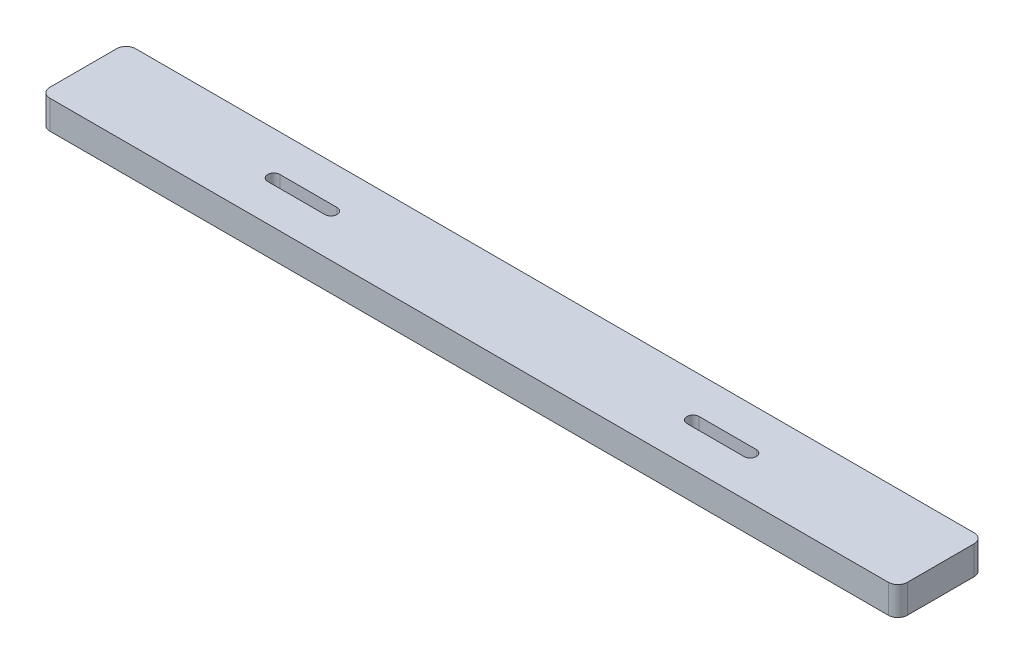
ISO-10303-21;
HEADER;
FILE_DESCRIPTION(('STEP AP214'),'2;1');
FILE_NAME('part.step','',(''),(''),'','','');
FILE_SCHEMA(('AUTOMOTIVE_DESIGN { 1 0 10303 214 1 1 1 1 }'));
ENDSEC;
DATA;
#1=APPLICATION_CONTEXT('core data for automotive mechanical design processes');
#2=APPLICATION_PROTOCOL_DEFINITION('international standard','automotive_design',2000,#1);
#3=PRODUCT_CONTEXT('',#1,'mechanical');
#4=PRODUCT('Part','Part','',(#3));
#5=PRODUCT_RELATED_PRODUCT_CATEGORY('part','',(#4));
#6=PRODUCT_DEFINITION_FORMATION('','',#4);
#7=PRODUCT_DEFINITION_CONTEXT('part definition',#1,'design');
#8=PRODUCT_DEFINITION('design','',#6,#7);
#9=PRODUCT_DEFINITION_SHAPE('','',#8);
#10=(LENGTH_UNIT() NAMED_UNIT(*) SI_UNIT(.MILLI.,.METRE.));
#11=(NAMED_UNIT(*) PLANE_ANGLE_UNIT() SI_UNIT($,.RADIAN.));
#12=(NAMED_UNIT(*) SI_UNIT($,.STERADIAN.) SOLID_ANGLE_UNIT());
#13=UNCERTAINTY_MEASURE_WITH_UNIT(LENGTH_MEASURE(1.E-05),#10,'distance_accuracy_value','');
#14=(GEOMETRIC_REPRESENTATION_CONTEXT(3) GLOBAL_UNCERTAINTY_ASSIGNED_CONTEXT((#13)) GLOBAL_UNIT_ASSIGNED_CONTEXT((#10,
#11,#12)) REPRESENTATION_CONTEXT('',''));
#15=CARTESIAN_POINT('',(0.,0.,0.));
#16=DIRECTION('',(0.,0.,1.));
#17=DIRECTION('',(1.,0.,0.));
#18=AXIS2_PLACEMENT_3D('',#15,#16,#17);
#19=CARTESIAN_POINT('',(-285.75,19.05,28.575));
#20=DIRECTION('',(1.,0.,0.));
#21=DIRECTION('',(0.,0.,-1.));
#22=AXIS2_PLACEMENT_3D('',#19,#20,#21);
#23=PLANE('',#22);
#24=DIRECTION('',(0.,0.,1.));
#25=VECTOR('',#24,1.);
#26=CARTESIAN_POINT('',(-285.75,19.05,28.575));
#27=LINE('',#26,#25);
#28=CARTESIAN_POINT('',(-285.75,19.05,-22.225));
#29=VERTEX_POINT('',#28);
#30=CARTESIAN_POINT('',(-285.75,19.05,22.225));
#31=VERTEX_POINT('',#30);
#32=EDGE_CURVE('E218',#29,#31,#27,.T.);
#33=ORIENTED_EDGE('',*,*,#32,.F.);
#34=DIRECTION('',(0.,-1.,0.));
#35=VECTOR('',#34,1.);
#36=CARTESIAN_POINT('',(-285.75,19.05,-22.225));
#37=LINE('',#36,#35);
#38=CARTESIAN_POINT('',(-285.75,0.,-22.225));
#39=VERTEX_POINT('',#38);
#40=EDGE_CURVE('E246',#29,#39,#37,.T.);
#41=ORIENTED_EDGE('',*,*,#40,.T.);
#42=DIRECTION('',(0.,0.,1.));
#43=VECTOR('',#42,1.);
#44=CARTESIAN_POINT('',(-285.75,0.,28.575));
#45=LINE('',#44,#43);
#46=CARTESIAN_POINT('',(-285.75,0.,22.225));
#47=VERTEX_POINT('',#46);
#48=EDGE_CURVE('E211',#39,#47,#45,.T.);
#49=ORIENTED_EDGE('',*,*,#48,.T.);
#50=DIRECTION('',(0.,-1.,0.));
#51=VECTOR('',#50,1.);
#52=CARTESIAN_POINT('',(-285.75,19.05,22.225));
#53=LINE('',#52,#51);
#54=EDGE_CURVE('E231',#47,#31,#53,.F.);
#55=ORIENTED_EDGE('',*,*,#54,.T.);
#56=EDGE_LOOP('',(#33,#41,#49,#55));
#57=FACE_BOUND('',#56,.T.);
#58=ADVANCED_FACE('F35',(#57),#23,.F.);
#59=CARTESIAN_POINT('',(285.75,19.05,28.575));
#60=DIRECTION('',(0.,0.,-1.));
#61=DIRECTION('',(-1.,0.,0.));
#62=AXIS2_PLACEMENT_3D('',#59,#60,#61);
#63=PLANE('',#62);
#64=DIRECTION('',(1.,0.,0.));
#65=VECTOR('',#64,1.);
#66=CARTESIAN_POINT('',(285.75,0.,28.575));
#67=LINE('',#66,#65);
#68=CARTESIAN_POINT('',(-279.4,0.,28.575));
#69=VERTEX_POINT('',#68);
#70=CARTESIAN_POINT('',(279.4,0.,28.575));
#71=VERTEX_POINT('',#70);
#72=EDGE_CURVE('E234',#69,#71,#67,.T.);
#73=ORIENTED_EDGE('',*,*,#72,.T.);
#74=DIRECTION('',(0.,-1.,0.));
#75=VECTOR('',#74,1.);
#76=CARTESIAN_POINT('',(279.4,19.05,28.575));
#77=LINE('',#76,#75);
#78=CARTESIAN_POINT('',(279.4,19.05,28.575));
#79=VERTEX_POINT('',#78);
#80=EDGE_CURVE('E11',#71,#79,#77,.F.);
#81=ORIENTED_EDGE('',*,*,#80,.T.);
#82=DIRECTION('',(1.,0.,0.));
#83=VECTOR('',#82,1.);
#84=CARTESIAN_POINT('',(285.75,19.05,28.575));
#85=LINE('',#84,#83);
#86=CARTESIAN_POINT('',(-279.4,19.05,28.575));
#87=VERTEX_POINT('',#86);
#88=EDGE_CURVE('E221',#87,#79,#85,.T.);
#89=ORIENTED_EDGE('',*,*,#88,.F.);
#90=DIRECTION('',(0.,-1.,0.));
#91=VECTOR('',#90,1.);
#92=CARTESIAN_POINT('',(-279.4,19.05,28.575));
#93=LINE('',#92,#91);
#94=EDGE_CURVE('E44',#87,#69,#93,.T.);
#95=ORIENTED_EDGE('',*,*,#94,.T.);
#96=EDGE_LOOP('',(#73,#81,#89,#95));
#97=FACE_BOUND('',#96,.T.);
#98=ADVANCED_FACE('F280',(#97),#63,.F.);
#99=CARTESIAN_POINT('',(285.75,19.05,28.575));
#100=DIRECTION('',(-1.,0.,0.));
#101=DIRECTION('',(0.,0.,1.));
#102=AXIS2_PLACEMENT_3D('',#99,#100,#101);
#103=PLANE('',#102);
#104=DIRECTION('',(0.,0.,-1.));
#105=VECTOR('',#104,1.);
#106=CARTESIAN_POINT('',(285.75,0.,28.575));
#107=LINE('',#106,#105);
#108=CARTESIAN_POINT('',(285.75,0.,22.225));
#109=VERTEX_POINT('',#108);
#110=CARTESIAN_POINT('',(285.75,0.,-22.225));
#111=VERTEX_POINT('',#110);
#112=EDGE_CURVE('E237',#109,#111,#107,.T.);
#113=ORIENTED_EDGE('',*,*,#112,.T.);
#114=DIRECTION('',(0.,-1.,0.));
#115=VECTOR('',#114,1.);
#116=CARTESIAN_POINT('',(285.75,19.05,-22.225));
#117=LINE('',#116,#115);
#118=CARTESIAN_POINT('',(285.75,19.05,-22.225));
#119=VERTEX_POINT('',#118);
#120=EDGE_CURVE('E274',#111,#119,#117,.F.);
#121=ORIENTED_EDGE('',*,*,#120,.T.);
#122=DIRECTION('',(0.,0.,-1.));
#123=VECTOR('',#122,1.);
#124=CARTESIAN_POINT('',(285.75,19.05,28.575));
#125=LINE('',#124,#123);
#126=CARTESIAN_POINT('',(285.75,19.05,22.225));
#127=VERTEX_POINT('',#126);
#128=EDGE_CURVE('E225',#127,#119,#125,.T.);
#129=ORIENTED_EDGE('',*,*,#128,.F.);
#130=DIRECTION('',(0.,-1.,0.));
#131=VECTOR('',#130,1.);
#132=CARTESIAN_POINT('',(285.75,19.05,22.225));
#133=LINE('',#132,#131);
#134=EDGE_CURVE('E271',#127,#109,#133,.T.);
#135=ORIENTED_EDGE('',*,*,#134,.T.);
#136=EDGE_LOOP('',(#113,#121,#129,#135));
#137=FACE_BOUND('',#136,.T.);
#138=ADVANCED_FACE('F293',(#137),#103,.F.);
#139=CARTESIAN_POINT('',(285.75,19.05,-28.575));
#140=DIRECTION('',(0.,0.,1.));
#141=DIRECTION('',(1.,0.,0.));
#142=AXIS2_PLACEMENT_3D('',#139,#140,#141);
#143=PLANE('',#142);
#144=DIRECTION('',(-1.,0.,0.));
#145=VECTOR('',#144,1.);
#146=CARTESIAN_POINT('',(285.75,0.,-28.575));
#147=LINE('',#146,#145);
#148=CARTESIAN_POINT('',(279.4,0.,-28.575));
#149=VERTEX_POINT('',#148);
#150=CARTESIAN_POINT('',(-279.4,0.,-28.575));
#151=VERTEX_POINT('',#150);
#152=EDGE_CURVE('E222',#149,#151,#147,.T.);
#153=ORIENTED_EDGE('',*,*,#152,.T.);
#154=DIRECTION('',(0.,-1.,0.));
#155=VECTOR('',#154,1.);
#156=CARTESIAN_POINT('',(-279.4,19.05,-28.575));
#157=LINE('',#156,#155);
#158=CARTESIAN_POINT('',(-279.4,19.05,-28.575));
#159=VERTEX_POINT('',#158);
#160=EDGE_CURVE('E260',#151,#159,#157,.F.);
#161=ORIENTED_EDGE('',*,*,#160,.T.);
#162=DIRECTION('',(-1.,0.,0.));
#163=VECTOR('',#162,1.);
#164=CARTESIAN_POINT('',(285.75,19.05,-28.575));
#165=LINE('',#164,#163);
#166=CARTESIAN_POINT('',(279.4,19.05,-28.575));
#167=VERTEX_POINT('',#166);
#168=EDGE_CURVE('E228',#167,#159,#165,.T.);
#169=ORIENTED_EDGE('',*,*,#168,.F.);
#170=DIRECTION('',(0.,-1.,0.));
#171=VECTOR('',#170,1.);
#172=CARTESIAN_POINT('',(279.4,19.05,-28.575));
#173=LINE('',#172,#171);
#174=EDGE_CURVE('E257',#167,#149,#173,.T.);
#175=ORIENTED_EDGE('',*,*,#174,.T.);
#176=EDGE_LOOP('',(#153,#161,#169,#175));
#177=FACE_BOUND('',#176,.T.);
#178=ADVANCED_FACE('F304',(#177),#143,.F.);
#179=CARTESIAN_POINT('',(0.,19.05,0.));
#180=DIRECTION('',(0.,1.,0.));
#181=DIRECTION('',(0.,0.,1.));
#182=AXIS2_PLACEMENT_3D('',#179,#180,#181);
#183=PLANE('',#182);
#184=CARTESIAN_POINT('',(120.65,19.05,0.));
#185=DIRECTION('',(0.,1.,0.));
#186=DIRECTION('',(0.,0.,-1.));
#187=AXIS2_PLACEMENT_3D('',#184,#185,#186);
#188=CIRCLE('',#187,4.06400000000001);
#189=CARTESIAN_POINT('',(120.65,19.05,-4.06400000000004));
#190=VERTEX_POINT('',#189);
#191=CARTESIAN_POINT('',(120.65,19.05,4.06399999999998));
#192=VERTEX_POINT('',#191);
#193=EDGE_CURVE('E51',#190,#192,#188,.T.);
#194=ORIENTED_EDGE('',*,*,#193,.F.);
#195=DIRECTION('',(-1.,0.,0.));
#196=VECTOR('',#195,1.);
#197=CARTESIAN_POINT('',(120.65,19.05,-4.06400000000004));
#198=LINE('',#197,#196);
#199=CARTESIAN_POINT('',(158.75,19.05,-4.06400000000001));
#200=VERTEX_POINT('',#199);
#201=EDGE_CURVE('E166',#200,#190,#198,.T.);
#202=ORIENTED_EDGE('',*,*,#201,.F.);
#203=CARTESIAN_POINT('',(158.75,19.05,0.));
#204=DIRECTION('',(0.,1.,0.));
#205=DIRECTION('',(0.,0.,-1.));
#206=AXIS2_PLACEMENT_3D('',#203,#204,#205);
#207=CIRCLE('',#206,4.06400000000002);
#208=CARTESIAN_POINT('',(158.75,19.05,4.06399999999998));
#209=VERTEX_POINT('',#208);
#210=EDGE_CURVE('E169',#209,#200,#207,.T.);
#211=ORIENTED_EDGE('',*,*,#210,.F.);
#212=DIRECTION('',(1.,0.,0.));
#213=VECTOR('',#212,1.);
#214=CARTESIAN_POINT('',(120.65,19.05,4.06399999999998));
#215=LINE('',#214,#213);
#216=EDGE_CURVE('E176',#192,#209,#215,.T.);
#217=ORIENTED_EDGE('',*,*,#216,.F.);
#218=EDGE_LOOP('',(#194,#202,#211,#217));
#219=FACE_BOUND('',#218,.T.);
#220=CARTESIAN_POINT('',(-120.65,19.05,0.));
#221=DIRECTION('',(0.,1.,0.));
#222=DIRECTION('',(0.,0.,1.));
#223=AXIS2_PLACEMENT_3D('',#220,#221,#222);
#224=CIRCLE('',#223,4.06400000000001);
#225=CARTESIAN_POINT('',(-120.65,19.05,4.06399999999998));
#226=VERTEX_POINT('',#225);
#227=CARTESIAN_POINT('',(-120.65,19.05,-4.06400000000004));
#228=VERTEX_POINT('',#227);
#229=EDGE_CURVE('E182',#226,#228,#224,.T.);
#230=ORIENTED_EDGE('',*,*,#229,.F.);
#231=DIRECTION('',(1.,0.,0.));
#232=VECTOR('',#231,1.);
#233=CARTESIAN_POINT('',(-120.65,19.05,4.06399999999998));
#234=LINE('',#233,#232);
#235=CARTESIAN_POINT('',(-158.75,19.05,4.06399999999998));
#236=VERTEX_POINT('',#235);
#237=EDGE_CURVE('E190',#236,#226,#234,.T.);
#238=ORIENTED_EDGE('',*,*,#237,.F.);
#239=CARTESIAN_POINT('',(-158.75,19.05,0.));
#240=DIRECTION('',(0.,1.,0.));
#241=DIRECTION('',(0.,0.,1.));
#242=AXIS2_PLACEMENT_3D('',#239,#240,#241);
#243=CIRCLE('',#242,4.06400000000002);
#244=CARTESIAN_POINT('',(-158.75,19.05,-4.06400000000001));
#245=VERTEX_POINT('',#244);
#246=EDGE_CURVE('E204',#245,#236,#243,.T.);
#247=ORIENTED_EDGE('',*,*,#246,.F.);
#248=DIRECTION('',(-1.,0.,0.));
#249=VECTOR('',#248,1.);
#250=CARTESIAN_POINT('',(-120.65,19.05,-4.06400000000004));
#251=LINE('',#250,#249);
#252=EDGE_CURVE('E201',#228,#245,#251,.T.);
#253=ORIENTED_EDGE('',*,*,#252,.F.);
#254=EDGE_LOOP('',(#230,#238,#247,#253));
#255=FACE_BOUND('',#254,.T.);
#256=ORIENTED_EDGE('',*,*,#168,.T.);
#257=CARTESIAN_POINT('',(-279.4,19.05,-22.225));
#258=DIRECTION('',(0.,1.,0.));
#259=DIRECTION('',(0.,0.,1.));
#260=AXIS2_PLACEMENT_3D('',#257,#258,#259);
#261=CIRCLE('',#260,6.35);
#262=EDGE_CURVE('E269',#159,#29,#261,.T.);
#263=ORIENTED_EDGE('',*,*,#262,.T.);
#264=ORIENTED_EDGE('',*,*,#32,.T.);
#265=CARTESIAN_POINT('',(-279.4,19.05,22.225));
#266=DIRECTION('',(0.,1.,0.));
#267=DIRECTION('',(0.,0.,1.));
#268=AXIS2_PLACEMENT_3D('',#265,#266,#267);
#269=CIRCLE('',#268,6.35);
#270=EDGE_CURVE('E263',#31,#87,#269,.T.);
#271=ORIENTED_EDGE('',*,*,#270,.T.);
#272=ORIENTED_EDGE('',*,*,#88,.T.);
#273=CARTESIAN_POINT('',(279.4,19.05,22.225));
#274=DIRECTION('',(0.,1.,0.));
#275=DIRECTION('',(0.,0.,1.));
#276=AXIS2_PLACEMENT_3D('',#273,#274,#275);
#277=CIRCLE('',#276,6.35);
#278=EDGE_CURVE('E265',#79,#127,#277,.T.);
#279=ORIENTED_EDGE('',*,*,#278,.T.);
#280=ORIENTED_EDGE('',*,*,#128,.T.);
#281=CARTESIAN_POINT('',(279.4,19.05,-22.225));
#282=DIRECTION('',(0.,1.,0.));
#283=DIRECTION('',(0.,0.,1.));
#284=AXIS2_PLACEMENT_3D('',#281,#282,#283);
#285=CIRCLE('',#284,6.35);
#286=EDGE_CURVE('E267',#119,#167,#285,.T.);
#287=ORIENTED_EDGE('',*,*,#286,.T.);
#288=EDGE_LOOP('',(#256,#263,#264,#271,#272,#279,#280,#287));
#289=FACE_BOUND('',#288,.T.);
#290=ADVANCED_FACE('F297',(#219,#255,#289),#183,.T.);
#291=CARTESIAN_POINT('',(0.,0.,0.));
#292=DIRECTION('',(0.,1.,0.));
#293=DIRECTION('',(0.,0.,1.));
#294=AXIS2_PLACEMENT_3D('',#291,#292,#293);
#295=PLANE('',#294);
#296=DIRECTION('',(-1.,0.,0.));
#297=VECTOR('',#296,1.);
#298=CARTESIAN_POINT('',(120.65,0.,-4.06400000000004));
#299=LINE('',#298,#297);
#300=CARTESIAN_POINT('',(158.75,0.,-4.06400000000001));
#301=VERTEX_POINT('',#300);
#302=CARTESIAN_POINT('',(120.65,0.,-4.06400000000004));
#303=VERTEX_POINT('',#302);
#304=EDGE_CURVE('E156',#301,#303,#299,.T.);
#305=ORIENTED_EDGE('',*,*,#304,.T.);
#306=CARTESIAN_POINT('',(120.65,0.,0.));
#307=DIRECTION('',(0.,1.,0.));
#308=DIRECTION('',(0.,0.,-1.));
#309=AXIS2_PLACEMENT_3D('',#306,#307,#308);
#310=CIRCLE('',#309,4.06400000000001);
#311=CARTESIAN_POINT('',(120.65,0.,4.06399999999998));
#312=VERTEX_POINT('',#311);
#313=EDGE_CURVE('E150',#303,#312,#310,.T.);
#314=ORIENTED_EDGE('',*,*,#313,.T.);
#315=DIRECTION('',(1.,0.,0.));
#316=VECTOR('',#315,1.);
#317=CARTESIAN_POINT('',(120.65,0.,4.06399999999998));
#318=LINE('',#317,#316);
#319=CARTESIAN_POINT('',(158.75,0.,4.06399999999998));
#320=VERTEX_POINT('',#319);
#321=EDGE_CURVE('E159',#312,#320,#318,.T.);
#322=ORIENTED_EDGE('',*,*,#321,.T.);
#323=CARTESIAN_POINT('',(158.75,0.,0.));
#324=DIRECTION('',(0.,1.,0.));
#325=DIRECTION('',(0.,0.,-1.));
#326=AXIS2_PLACEMENT_3D('',#323,#324,#325);
#327=CIRCLE('',#326,4.06400000000002);
#328=EDGE_CURVE('E59',#320,#301,#327,.T.);
#329=ORIENTED_EDGE('',*,*,#328,.T.);
#330=EDGE_LOOP('',(#305,#314,#322,#329));
#331=FACE_BOUND('',#330,.T.);
#332=DIRECTION('',(1.,0.,0.));
#333=VECTOR('',#332,1.);
#334=CARTESIAN_POINT('',(-120.65,0.,4.06399999999998));
#335=LINE('',#334,#333);
#336=CARTESIAN_POINT('',(-158.75,0.,4.06399999999998));
#337=VERTEX_POINT('',#336);
#338=CARTESIAN_POINT('',(-120.65,0.,4.06399999999998));
#339=VERTEX_POINT('',#338);
#340=EDGE_CURVE('E196',#337,#339,#335,.T.);
#341=ORIENTED_EDGE('',*,*,#340,.T.);
#342=CARTESIAN_POINT('',(-120.65,0.,0.));
#343=DIRECTION('',(0.,1.,0.));
#344=DIRECTION('',(0.,0.,1.));
#345=AXIS2_PLACEMENT_3D('',#342,#343,#344);
#346=CIRCLE('',#345,4.06400000000001);
#347=CARTESIAN_POINT('',(-120.65,0.,-4.06400000000004));
#348=VERTEX_POINT('',#347);
#349=EDGE_CURVE('E186',#339,#348,#346,.T.);
#350=ORIENTED_EDGE('',*,*,#349,.T.);
#351=DIRECTION('',(-1.,0.,0.));
#352=VECTOR('',#351,1.);
#353=CARTESIAN_POINT('',(-120.65,0.,-4.06400000000004));
#354=LINE('',#353,#352);
#355=CARTESIAN_POINT('',(-158.75,0.,-4.06400000000006));
#356=VERTEX_POINT('',#355);
#357=EDGE_CURVE('E189',#348,#356,#354,.T.);
#358=ORIENTED_EDGE('',*,*,#357,.T.);
#359=CARTESIAN_POINT('',(-158.75,0.,0.));
#360=DIRECTION('',(0.,1.,0.));
#361=DIRECTION('',(0.,0.,1.));
#362=AXIS2_PLACEMENT_3D('',#359,#360,#361);
#363=CIRCLE('',#362,4.06400000000002);
#364=EDGE_CURVE('E193',#356,#337,#363,.T.);
#365=ORIENTED_EDGE('',*,*,#364,.T.);
#366=EDGE_LOOP('',(#341,#350,#358,#365));
#367=FACE_BOUND('',#366,.T.);
#368=ORIENTED_EDGE('',*,*,#48,.F.);
#369=CARTESIAN_POINT('',(-279.4,0.,-22.225));
#370=DIRECTION('',(0.,1.,0.));
#371=DIRECTION('',(0.,0.,1.));
#372=AXIS2_PLACEMENT_3D('',#369,#370,#371);
#373=CIRCLE('',#372,6.35);
#374=EDGE_CURVE('E255',#39,#151,#373,.F.);
#375=ORIENTED_EDGE('',*,*,#374,.T.);
#376=ORIENTED_EDGE('',*,*,#152,.F.);
#377=CARTESIAN_POINT('',(279.4,0.,-22.225));
#378=DIRECTION('',(0.,1.,0.));
#379=DIRECTION('',(0.,0.,1.));
#380=AXIS2_PLACEMENT_3D('',#377,#378,#379);
#381=CIRCLE('',#380,6.35);
#382=EDGE_CURVE('E253',#149,#111,#381,.F.);
#383=ORIENTED_EDGE('',*,*,#382,.T.);
#384=ORIENTED_EDGE('',*,*,#112,.F.);
#385=CARTESIAN_POINT('',(279.4,0.,22.225));
#386=DIRECTION('',(0.,1.,0.));
#387=DIRECTION('',(0.,0.,1.));
#388=AXIS2_PLACEMENT_3D('',#385,#386,#387);
#389=CIRCLE('',#388,6.35);
#390=EDGE_CURVE('E251',#109,#71,#389,.F.);
#391=ORIENTED_EDGE('',*,*,#390,.T.);
#392=ORIENTED_EDGE('',*,*,#72,.F.);
#393=CARTESIAN_POINT('',(-279.4,0.,22.225));
#394=DIRECTION('',(0.,1.,0.));
#395=DIRECTION('',(0.,0.,1.));
#396=AXIS2_PLACEMENT_3D('',#393,#394,#395);
#397=CIRCLE('',#396,6.35);
#398=EDGE_CURVE('E249',#69,#47,#397,.F.);
#399=ORIENTED_EDGE('',*,*,#398,.T.);
#400=EDGE_LOOP('',(#368,#375,#376,#383,#384,#391,#392,#399));
#401=FACE_BOUND('',#400,.T.);
#402=ADVANCED_FACE('F163',(#331,#367,#401),#295,.F.);
#403=CARTESIAN_POINT('',(-279.4,19.05,-22.225));
#404=DIRECTION('',(0.,-1.,0.));
#405=DIRECTION('',(0.,0.,-1.));
#406=AXIS2_PLACEMENT_3D('',#403,#404,#405);
#407=CYLINDRICAL_SURFACE('',#406,6.35);
#408=ORIENTED_EDGE('',*,*,#262,.F.);
#409=ORIENTED_EDGE('',*,*,#160,.F.);
#410=ORIENTED_EDGE('',*,*,#374,.F.);
#411=ORIENTED_EDGE('',*,*,#40,.F.);
#412=EDGE_LOOP('',(#408,#409,#410,#411));
#413=FACE_BOUND('',#412,.T.);
#414=ADVANCED_FACE('F309',(#413),#407,.T.);
#415=CARTESIAN_POINT('',(279.4,19.05,-22.225));
#416=DIRECTION('',(0.,-1.,0.));
#417=DIRECTION('',(0.,0.,-1.));
#418=AXIS2_PLACEMENT_3D('',#415,#416,#417);
#419=CYLINDRICAL_SURFACE('',#418,6.35);
#420=ORIENTED_EDGE('',*,*,#286,.F.);
#421=ORIENTED_EDGE('',*,*,#120,.F.);
#422=ORIENTED_EDGE('',*,*,#382,.F.);
#423=ORIENTED_EDGE('',*,*,#174,.F.);
#424=EDGE_LOOP('',(#420,#421,#422,#423));
#425=FACE_BOUND('',#424,.T.);
#426=ADVANCED_FACE('F301',(#425),#419,.T.);
#427=CARTESIAN_POINT('',(279.4,19.05,22.225));
#428=DIRECTION('',(0.,-1.,0.));
#429=DIRECTION('',(0.,0.,-1.));
#430=AXIS2_PLACEMENT_3D('',#427,#428,#429);
#431=CYLINDRICAL_SURFACE('',#430,6.35);
#432=ORIENTED_EDGE('',*,*,#278,.F.);
#433=ORIENTED_EDGE('',*,*,#80,.F.);
#434=ORIENTED_EDGE('',*,*,#390,.F.);
#435=ORIENTED_EDGE('',*,*,#134,.F.);
#436=EDGE_LOOP('',(#432,#433,#434,#435));
#437=FACE_BOUND('',#436,.T.);
#438=ADVANCED_FACE('F290',(#437),#431,.T.);
#439=CARTESIAN_POINT('',(-279.4,19.05,22.225));
#440=DIRECTION('',(0.,-1.,0.));
#441=DIRECTION('',(0.,0.,-1.));
#442=AXIS2_PLACEMENT_3D('',#439,#440,#441);
#443=CYLINDRICAL_SURFACE('',#442,6.35);
#444=ORIENTED_EDGE('',*,*,#270,.F.);
#445=ORIENTED_EDGE('',*,*,#54,.F.);
#446=ORIENTED_EDGE('',*,*,#398,.F.);
#447=ORIENTED_EDGE('',*,*,#94,.F.);
#448=EDGE_LOOP('',(#444,#445,#446,#447));
#449=FACE_BOUND('',#448,.T.);
#450=ADVANCED_FACE('F37',(#449),#443,.T.);
#451=CARTESIAN_POINT('',(-120.65,0.,0.));
#452=DIRECTION('',(0.,1.,0.));
#453=DIRECTION('',(0.,0.,1.));
#454=AXIS2_PLACEMENT_3D('',#451,#452,#453);
#455=CYLINDRICAL_SURFACE('',#454,4.06400000000001);
#456=ORIENTED_EDGE('',*,*,#229,.T.);
#457=DIRECTION('',(0.,1.,0.));
#458=VECTOR('',#457,1.);
#459=CARTESIAN_POINT('',(-120.65,0.,-4.06400000000004));
#460=LINE('',#459,#458);
#461=EDGE_CURVE('E199',#348,#228,#460,.T.);
#462=ORIENTED_EDGE('',*,*,#461,.F.);
#463=ORIENTED_EDGE('',*,*,#349,.F.);
#464=DIRECTION('',(0.,1.,0.));
#465=VECTOR('',#464,1.);
#466=CARTESIAN_POINT('',(-120.65,0.,4.06399999999998));
#467=LINE('',#466,#465);
#468=EDGE_CURVE('E209',#339,#226,#467,.T.);
#469=ORIENTED_EDGE('',*,*,#468,.T.);
#470=EDGE_LOOP('',(#456,#462,#463,#469));
#471=FACE_BOUND('',#470,.T.);
#472=ADVANCED_FACE('F314',(#471),#455,.F.);
#473=CARTESIAN_POINT('',(-120.65,0.,4.06399999999998));
#474=DIRECTION('',(0.,0.,1.));
#475=DIRECTION('',(1.,0.,0.));
#476=AXIS2_PLACEMENT_3D('',#473,#474,#475);
#477=PLANE('',#476);
#478=ORIENTED_EDGE('',*,*,#237,.T.);
#479=ORIENTED_EDGE('',*,*,#468,.F.);
#480=ORIENTED_EDGE('',*,*,#340,.F.);
#481=DIRECTION('',(0.,1.,0.));
#482=VECTOR('',#481,1.);
#483=CARTESIAN_POINT('',(-158.75,0.,4.06399999999998));
#484=LINE('',#483,#482);
#485=EDGE_CURVE('E212',#337,#236,#484,.T.);
#486=ORIENTED_EDGE('',*,*,#485,.T.);
#487=EDGE_LOOP('',(#478,#479,#480,#486));
#488=FACE_BOUND('',#487,.T.);
#489=ADVANCED_FACE('F319',(#488),#477,.F.);
#490=CARTESIAN_POINT('',(-158.75,0.,0.));
#491=DIRECTION('',(0.,1.,0.));
#492=DIRECTION('',(0.,0.,1.));
#493=AXIS2_PLACEMENT_3D('',#490,#491,#492);
#494=CYLINDRICAL_SURFACE('',#493,4.06400000000002);
#495=ORIENTED_EDGE('',*,*,#246,.T.);
#496=ORIENTED_EDGE('',*,*,#485,.F.);
#497=ORIENTED_EDGE('',*,*,#364,.F.);
#498=DIRECTION('',(0.,1.,0.));
#499=VECTOR('',#498,1.);
#500=CARTESIAN_POINT('',(-158.75,0.,-4.06400000000001));
#501=LINE('',#500,#499);
#502=EDGE_CURVE('E214',#356,#245,#501,.T.);
#503=ORIENTED_EDGE('',*,*,#502,.T.);
#504=EDGE_LOOP('',(#495,#496,#497,#503));
#505=FACE_BOUND('',#504,.T.);
#506=ADVANCED_FACE('F383',(#505),#494,.F.);
#507=CARTESIAN_POINT('',(-120.65,0.,-4.06400000000004));
#508=DIRECTION('',(0.,0.,-1.));
#509=DIRECTION('',(-1.,0.,0.));
#510=AXIS2_PLACEMENT_3D('',#507,#508,#509);
#511=PLANE('',#510);
#512=ORIENTED_EDGE('',*,*,#252,.T.);
#513=ORIENTED_EDGE('',*,*,#502,.F.);
#514=ORIENTED_EDGE('',*,*,#357,.F.);
#515=ORIENTED_EDGE('',*,*,#461,.T.);
#516=EDGE_LOOP('',(#512,#513,#514,#515));
#517=FACE_BOUND('',#516,.T.);
#518=ADVANCED_FACE('F394',(#517),#511,.F.);
#519=CARTESIAN_POINT('',(120.65,0.,0.));
#520=DIRECTION('',(0.,1.,0.));
#521=DIRECTION('',(0.,0.,1.));
#522=AXIS2_PLACEMENT_3D('',#519,#520,#521);
#523=CYLINDRICAL_SURFACE('',#522,4.06400000000001);
#524=ORIENTED_EDGE('',*,*,#193,.T.);
#525=DIRECTION('',(0.,1.,0.));
#526=VECTOR('',#525,1.);
#527=CARTESIAN_POINT('',(120.65,0.,4.06399999999998));
#528=LINE('',#527,#526);
#529=EDGE_CURVE('E146',#312,#192,#528,.T.);
#530=ORIENTED_EDGE('',*,*,#529,.F.);
#531=ORIENTED_EDGE('',*,*,#313,.F.);
#532=DIRECTION('',(0.,1.,0.));
#533=VECTOR('',#532,1.);
#534=CARTESIAN_POINT('',(120.65,0.,-4.06400000000004));
#535=LINE('',#534,#533);
#536=EDGE_CURVE('E180',#303,#190,#535,.T.);
#537=ORIENTED_EDGE('',*,*,#536,.T.);
#538=EDGE_LOOP('',(#524,#530,#531,#537));
#539=FACE_BOUND('',#538,.T.);
#540=ADVANCED_FACE('F148',(#539),#523,.F.);
#541=CARTESIAN_POINT('',(120.65,0.,-4.06400000000004));
#542=DIRECTION('',(0.,0.,-1.));
#543=DIRECTION('',(-1.,0.,0.));
#544=AXIS2_PLACEMENT_3D('',#541,#542,#543);
#545=PLANE('',#544);
#546=ORIENTED_EDGE('',*,*,#201,.T.);
#547=ORIENTED_EDGE('',*,*,#536,.F.);
#548=ORIENTED_EDGE('',*,*,#304,.F.);
#549=DIRECTION('',(0.,1.,0.));
#550=VECTOR('',#549,1.);
#551=CARTESIAN_POINT('',(158.75,0.,-4.06400000000001));
#552=LINE('',#551,#550);
#553=EDGE_CURVE('E183',#301,#200,#552,.T.);
#554=ORIENTED_EDGE('',*,*,#553,.T.);
#555=EDGE_LOOP('',(#546,#547,#548,#554));
#556=FACE_BOUND('',#555,.T.);
#557=ADVANCED_FACE('F415',(#556),#545,.F.);
#558=CARTESIAN_POINT('',(158.75,0.,0.));
#559=DIRECTION('',(0.,1.,0.));
#560=DIRECTION('',(0.,0.,1.));
#561=AXIS2_PLACEMENT_3D('',#558,#559,#560);
#562=CYLINDRICAL_SURFACE('',#561,4.06400000000002);
#563=ORIENTED_EDGE('',*,*,#210,.T.);
#564=ORIENTED_EDGE('',*,*,#553,.F.);
#565=ORIENTED_EDGE('',*,*,#328,.F.);
#566=DIRECTION('',(0.,1.,0.));
#567=VECTOR('',#566,1.);
#568=CARTESIAN_POINT('',(158.75,0.,4.06399999999998));
#569=LINE('',#568,#567);
#570=EDGE_CURVE('E155',#320,#209,#569,.T.);
#571=ORIENTED_EDGE('',*,*,#570,.T.);
#572=EDGE_LOOP('',(#563,#564,#565,#571));
#573=FACE_BOUND('',#572,.T.);
#574=ADVANCED_FACE('F426',(#573),#562,.F.);
#575=CARTESIAN_POINT('',(120.65,0.,4.06399999999998));
#576=DIRECTION('',(0.,0.,1.));
#577=DIRECTION('',(1.,0.,0.));
#578=AXIS2_PLACEMENT_3D('',#575,#576,#577);
#579=PLANE('',#578);
#580=ORIENTED_EDGE('',*,*,#216,.T.);
#581=ORIENTED_EDGE('',*,*,#570,.F.);
#582=ORIENTED_EDGE('',*,*,#321,.F.);
#583=ORIENTED_EDGE('',*,*,#529,.T.);
#584=EDGE_LOOP('',(#580,#581,#582,#583));
#585=FACE_BOUND('',#584,.T.);
#586=ADVANCED_FACE('F160',(#585),#579,.F.);
#587=CLOSED_SHELL('',(#58,#98,#138,#178,#290,#402,#414,#426,#438,#450,#472,#489,#506,#518,#540,
#557,#574,#586));
#588=MANIFOLD_SOLID_BREP('B2',#587);
#589=ADVANCED_BREP_SHAPE_REPRESENTATION('',(#18,#588),#14);
#590=SHAPE_DEFINITION_REPRESENTATION(#9,#589);
ENDSEC;
END-ISO-10303-21;
